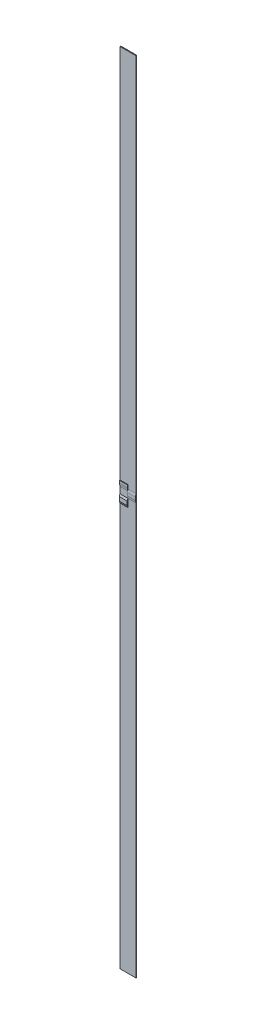
ISO-10303-21;
HEADER;
FILE_DESCRIPTION(('STEP AP214'),'2;1');
FILE_NAME('part.step','',(''),(''),'','','');
FILE_SCHEMA(('AUTOMOTIVE_DESIGN { 1 0 10303 214 1 1 1 1 }'));
ENDSEC;
DATA;
#1=APPLICATION_CONTEXT('core data for automotive mechanical design processes');
#2=APPLICATION_PROTOCOL_DEFINITION('international standard','automotive_design',2000,#1);
#3=PRODUCT_CONTEXT('',#1,'mechanical');
#4=PRODUCT('Part','Part','',(#3));
#5=PRODUCT_RELATED_PRODUCT_CATEGORY('part','',(#4));
#6=PRODUCT_DEFINITION_FORMATION('','',#4);
#7=PRODUCT_DEFINITION_CONTEXT('part definition',#1,'design');
#8=PRODUCT_DEFINITION('design','',#6,#7);
#9=PRODUCT_DEFINITION_SHAPE('','',#8);
#10=(LENGTH_UNIT() NAMED_UNIT(*) SI_UNIT(.MILLI.,.METRE.));
#11=(NAMED_UNIT(*) PLANE_ANGLE_UNIT() SI_UNIT($,.RADIAN.));
#12=(NAMED_UNIT(*) SI_UNIT($,.STERADIAN.) SOLID_ANGLE_UNIT());
#13=UNCERTAINTY_MEASURE_WITH_UNIT(LENGTH_MEASURE(1.E-05),#10,'distance_accuracy_value','');
#14=(GEOMETRIC_REPRESENTATION_CONTEXT(3) GLOBAL_UNCERTAINTY_ASSIGNED_CONTEXT((#13)) GLOBAL_UNIT_ASSIGNED_CONTEXT((#10,
#11,#12)) REPRESENTATION_CONTEXT('',''));
#15=CARTESIAN_POINT('',(0.,0.,0.));
#16=DIRECTION('',(0.,0.,1.));
#17=DIRECTION('',(1.,0.,0.));
#18=AXIS2_PLACEMENT_3D('',#15,#16,#17);
#19=CARTESIAN_POINT('',(0.,0.,100.));
#20=DIRECTION('',(0.,0.,-1.));
#21=DIRECTION('',(-1.,0.,0.));
#22=AXIS2_PLACEMENT_3D('',#19,#20,#21);
#23=PLANE('',#22);
#24=DIRECTION('',(0.,-1.,0.));
#25=VECTOR('',#24,1.);
#26=CARTESIAN_POINT('',(-5.80696598741327E-12,50000.,100.));
#27=LINE('',#26,#25);
#28=CARTESIAN_POINT('',(-3.67394039744204E-13,3000.,100.));
#29=VERTEX_POINT('',#28);
#30=CARTESIAN_POINT('',(2.22044604925031E-13,2500.,100.));
#31=VERTEX_POINT('',#30);
#32=EDGE_CURVE('E194',#29,#31,#27,.T.);
#33=ORIENTED_EDGE('',*,*,#32,.T.);
#34=DIRECTION('',(1.,0.,0.));
#35=VECTOR('',#34,1.);
#36=CARTESIAN_POINT('',(2.22044604925031E-13,2500.,100.));
#37=LINE('',#36,#35);
#38=CARTESIAN_POINT('',(1000.,2500.,100.));
#39=VERTEX_POINT('',#38);
#40=EDGE_CURVE('E295',#31,#39,#37,.T.);
#41=ORIENTED_EDGE('',*,*,#40,.T.);
#42=DIRECTION('',(0.,1.,0.));
#43=VECTOR('',#42,1.);
#44=CARTESIAN_POINT('',(999.999999999994,50000.,100.));
#45=LINE('',#44,#43);
#46=CARTESIAN_POINT('',(999.999999999994,50000.,100.));
#47=VERTEX_POINT('',#46);
#48=EDGE_CURVE('E139',#39,#47,#45,.T.);
#49=ORIENTED_EDGE('',*,*,#48,.T.);
#50=DIRECTION('',(-1.,0.,0.));
#51=VECTOR('',#50,1.);
#52=CARTESIAN_POINT('',(-5.80696598741327E-12,50000.,100.));
#53=LINE('',#52,#51);
#54=CARTESIAN_POINT('',(-1000.00000000001,50000.,100.));
#55=VERTEX_POINT('',#54);
#56=EDGE_CURVE('E162',#47,#55,#53,.T.);
#57=ORIENTED_EDGE('',*,*,#56,.T.);
#58=DIRECTION('',(0.,-1.,0.));
#59=VECTOR('',#58,1.);
#60=CARTESIAN_POINT('',(-1000.00000000001,50000.,100.));
#61=LINE('',#60,#59);
#62=CARTESIAN_POINT('',(-1000.,3000.,100.));
#63=VERTEX_POINT('',#62);
#64=EDGE_CURVE('E212',#55,#63,#61,.T.);
#65=ORIENTED_EDGE('',*,*,#64,.T.);
#66=DIRECTION('',(1.,0.,0.));
#67=VECTOR('',#66,1.);
#68=CARTESIAN_POINT('',(-1000.,3000.,100.));
#69=LINE('',#68,#67);
#70=EDGE_CURVE('E226',#63,#29,#69,.T.);
#71=ORIENTED_EDGE('',*,*,#70,.T.);
#72=EDGE_LOOP('',(#33,#41,#49,#57,#65,#71));
#73=FACE_BOUND('',#72,.T.);
#74=ADVANCED_FACE('F114',(#73),#23,.F.);
#75=CARTESIAN_POINT('',(1000.00000000001,-50000.,100.));
#76=VERTEX_POINT('',#75);
#77=CARTESIAN_POINT('',(1000.,1500.,100.));
#78=VERTEX_POINT('',#77);
#79=EDGE_CURVE('E172',#76,#78,#45,.T.);
#80=ORIENTED_EDGE('',*,*,#79,.T.);
#81=DIRECTION('',(1.,0.,0.));
#82=VECTOR('',#81,1.);
#83=CARTESIAN_POINT('',(2.22044604925031E-13,1500.,100.));
#84=LINE('',#83,#82);
#85=CARTESIAN_POINT('',(2.22044604925031E-13,1500.,100.));
#86=VERTEX_POINT('',#85);
#87=EDGE_CURVE('E220',#86,#78,#84,.T.);
#88=ORIENTED_EDGE('',*,*,#87,.F.);
#89=CARTESIAN_POINT('',(0.,500.,100.));
#90=VERTEX_POINT('',#89);
#91=EDGE_CURVE('E195',#86,#90,#27,.T.);
#92=ORIENTED_EDGE('',*,*,#91,.T.);
#93=DIRECTION('',(1.,0.,0.));
#94=VECTOR('',#93,1.);
#95=CARTESIAN_POINT('',(-1000.,500.,100.));
#96=LINE('',#95,#94);
#97=CARTESIAN_POINT('',(-1000.,500.,100.));
#98=VERTEX_POINT('',#97);
#99=EDGE_CURVE('E265',#98,#90,#96,.T.);
#100=ORIENTED_EDGE('',*,*,#99,.F.);
#101=DIRECTION('',(0.,-1.,0.));
#102=VECTOR('',#101,1.);
#103=CARTESIAN_POINT('',(-1000.,500.,100.));
#104=LINE('',#103,#102);
#105=CARTESIAN_POINT('',(-999.999999999994,-50000.,100.));
#106=VERTEX_POINT('',#105);
#107=EDGE_CURVE('E208',#98,#106,#104,.T.);
#108=ORIENTED_EDGE('',*,*,#107,.T.);
#109=DIRECTION('',(1.,0.,0.));
#110=VECTOR('',#109,1.);
#111=CARTESIAN_POINT('',(6.12323399573677E-12,-50000.,100.));
#112=LINE('',#111,#110);
#113=EDGE_CURVE('E191',#106,#76,#112,.T.);
#114=ORIENTED_EDGE('',*,*,#113,.T.);
#115=EDGE_LOOP('',(#80,#88,#92,#100,#108,#114));
#116=FACE_BOUND('',#115,.T.);
#117=ADVANCED_FACE('F369',(#116),#23,.F.);
#118=CARTESIAN_POINT('',(-5.80696598741327E-12,50000.,100.));
#119=DIRECTION('',(0.,-1.,0.));
#120=DIRECTION('',(0.,0.,-1.));
#121=AXIS2_PLACEMENT_3D('',#118,#119,#120);
#122=PLANE('',#121);
#123=DIRECTION('',(-1.,0.,0.));
#124=VECTOR('',#123,1.);
#125=CARTESIAN_POINT('',(-5.80696598741327E-12,50000.,0.));
#126=LINE('',#125,#124);
#127=CARTESIAN_POINT('',(999.999999999994,50000.,0.));
#128=VERTEX_POINT('',#127);
#129=CARTESIAN_POINT('',(-1000.00000000001,50000.,0.));
#130=VERTEX_POINT('',#129);
#131=EDGE_CURVE('E169',#128,#130,#126,.T.);
#132=ORIENTED_EDGE('',*,*,#131,.T.);
#133=DIRECTION('',(0.,0.,1.));
#134=VECTOR('',#133,1.);
#135=CARTESIAN_POINT('',(-1000.00000000001,50000.,0.));
#136=LINE('',#135,#134);
#137=EDGE_CURVE('E217',#130,#55,#136,.T.);
#138=ORIENTED_EDGE('',*,*,#137,.T.);
#139=ORIENTED_EDGE('',*,*,#56,.F.);
#140=DIRECTION('',(0.,0.,-1.));
#141=VECTOR('',#140,1.);
#142=CARTESIAN_POINT('',(999.999999999994,50000.,100.));
#143=LINE('',#142,#141);
#144=EDGE_CURVE('E123',#47,#128,#143,.T.);
#145=ORIENTED_EDGE('',*,*,#144,.T.);
#146=EDGE_LOOP('',(#132,#138,#139,#145));
#147=FACE_BOUND('',#146,.T.);
#148=ADVANCED_FACE('F116',(#147),#122,.F.);
#149=CARTESIAN_POINT('',(6.12323399573677E-12,-50000.,100.));
#150=DIRECTION('',(0.,1.,0.));
#151=DIRECTION('',(0.,0.,1.));
#152=AXIS2_PLACEMENT_3D('',#149,#150,#151);
#153=PLANE('',#152);
#154=DIRECTION('',(1.,0.,0.));
#155=VECTOR('',#154,1.);
#156=CARTESIAN_POINT('',(6.12323399573677E-12,-50000.,0.));
#157=LINE('',#156,#155);
#158=CARTESIAN_POINT('',(-999.999999999994,-50000.,0.));
#159=VERTEX_POINT('',#158);
#160=CARTESIAN_POINT('',(1000.00000000001,-50000.,0.));
#161=VERTEX_POINT('',#160);
#162=EDGE_CURVE('E163',#159,#161,#157,.T.);
#163=ORIENTED_EDGE('',*,*,#162,.T.);
#164=DIRECTION('',(0.,0.,-1.));
#165=VECTOR('',#164,1.);
#166=CARTESIAN_POINT('',(1000.00000000001,-50000.,100.));
#167=LINE('',#166,#165);
#168=EDGE_CURVE('E12',#76,#161,#167,.T.);
#169=ORIENTED_EDGE('',*,*,#168,.F.);
#170=ORIENTED_EDGE('',*,*,#113,.F.);
#171=DIRECTION('',(0.,0.,1.));
#172=VECTOR('',#171,1.);
#173=CARTESIAN_POINT('',(-999.999999999994,-50000.,0.));
#174=LINE('',#173,#172);
#175=EDGE_CURVE('E204',#159,#106,#174,.T.);
#176=ORIENTED_EDGE('',*,*,#175,.F.);
#177=EDGE_LOOP('',(#163,#169,#170,#176));
#178=FACE_BOUND('',#177,.T.);
#179=ADVANCED_FACE('F430',(#178),#153,.F.);
#180=CARTESIAN_POINT('',(999.999999999994,50000.,100.));
#181=DIRECTION('',(-1.,0.,0.));
#182=DIRECTION('',(0.,-1.,0.));
#183=AXIS2_PLACEMENT_3D('',#180,#181,#182);
#184=PLANE('',#183);
#185=DIRECTION('',(0.,1.,0.));
#186=VECTOR('',#185,1.);
#187=CARTESIAN_POINT('',(999.999999999994,50000.,0.));
#188=LINE('',#187,#186);
#189=EDGE_CURVE('E152',#161,#128,#188,.T.);
#190=ORIENTED_EDGE('',*,*,#189,.T.);
#191=ORIENTED_EDGE('',*,*,#144,.F.);
#192=ORIENTED_EDGE('',*,*,#48,.F.);
#193=DIRECTION('',(0.,-0.98058067569092,0.196116135138184));
#194=VECTOR('',#193,1.);
#195=CARTESIAN_POINT('',(1000.,2200.,160.));
#196=LINE('',#195,#194);
#197=CARTESIAN_POINT('',(1000.,2200.,160.));
#198=VERTEX_POINT('',#197);
#199=EDGE_CURVE('E319',#39,#198,#196,.T.);
#200=ORIENTED_EDGE('',*,*,#199,.T.);
#201=DIRECTION('',(0.,-1.,0.));
#202=VECTOR('',#201,1.);
#203=CARTESIAN_POINT('',(1000.,1800.,160.));
#204=LINE('',#203,#202);
#205=CARTESIAN_POINT('',(1000.,1800.,160.));
#206=VERTEX_POINT('',#205);
#207=EDGE_CURVE('E315',#198,#206,#204,.T.);
#208=ORIENTED_EDGE('',*,*,#207,.T.);
#209=DIRECTION('',(0.,-0.98058067569092,-0.196116135138184));
#210=VECTOR('',#209,1.);
#211=CARTESIAN_POINT('',(1000.,1500.,100.));
#212=LINE('',#211,#210);
#213=EDGE_CURVE('E310',#206,#78,#212,.T.);
#214=ORIENTED_EDGE('',*,*,#213,.T.);
#215=ORIENTED_EDGE('',*,*,#79,.F.);
#216=ORIENTED_EDGE('',*,*,#168,.T.);
#217=EDGE_LOOP('',(#190,#191,#192,#200,#208,#214,#215,#216));
#218=FACE_BOUND('',#217,.T.);
#219=ADVANCED_FACE('F154',(#218),#184,.F.);
#220=DIRECTION('',(1.,0.,0.));
#221=VECTOR('',#220,1.);
#222=CARTESIAN_POINT('',(-1000.,1500.,100.));
#223=LINE('',#222,#221);
#224=CARTESIAN_POINT('',(-1000.,1500.,100.));
#225=VERTEX_POINT('',#224);
#226=EDGE_CURVE('E185',#225,#86,#223,.T.);
#227=ORIENTED_EDGE('',*,*,#226,.T.);
#228=DIRECTION('',(0.,1.,0.));
#229=VECTOR('',#228,1.);
#230=CARTESIAN_POINT('',(2.22044604925031E-13,1500.,100.));
#231=LINE('',#230,#229);
#232=CARTESIAN_POINT('',(0.,2300.,100.));
#233=VERTEX_POINT('',#232);
#234=EDGE_CURVE('E314',#86,#233,#231,.T.);
#235=ORIENTED_EDGE('',*,*,#234,.T.);
#236=DIRECTION('',(1.,0.,0.));
#237=VECTOR('',#236,1.);
#238=CARTESIAN_POINT('',(-1000.,2300.,100.));
#239=LINE('',#238,#237);
#240=CARTESIAN_POINT('',(-1000.,2300.,100.));
#241=VERTEX_POINT('',#240);
#242=EDGE_CURVE('E230',#241,#233,#239,.T.);
#243=ORIENTED_EDGE('',*,*,#242,.F.);
#244=EDGE_CURVE('E216',#241,#225,#61,.T.);
#245=ORIENTED_EDGE('',*,*,#244,.T.);
#246=EDGE_LOOP('',(#227,#235,#243,#245));
#247=FACE_BOUND('',#246,.T.);
#248=ADVANCED_FACE('F380',(#247),#23,.F.);
#249=CARTESIAN_POINT('',(0.,0.,0.));
#250=DIRECTION('',(0.,0.,-1.));
#251=DIRECTION('',(-1.,0.,0.));
#252=AXIS2_PLACEMENT_3D('',#249,#250,#251);
#253=PLANE('',#252);
#254=ORIENTED_EDGE('',*,*,#131,.F.);
#255=ORIENTED_EDGE('',*,*,#189,.F.);
#256=ORIENTED_EDGE('',*,*,#162,.F.);
#257=DIRECTION('',(0.,-1.,0.));
#258=VECTOR('',#257,1.);
#259=CARTESIAN_POINT('',(-1000.00000000001,50000.,0.));
#260=LINE('',#259,#258);
#261=EDGE_CURVE('E175',#130,#159,#260,.T.);
#262=ORIENTED_EDGE('',*,*,#261,.F.);
#263=EDGE_LOOP('',(#254,#255,#256,#262));
#264=FACE_BOUND('',#263,.T.);
#265=ADVANCED_FACE('F173',(#264),#253,.T.);
#266=CARTESIAN_POINT('',(0.,0.,0.));
#267=DIRECTION('',(-1.,0.,0.));
#268=DIRECTION('',(0.,-1.,0.));
#269=AXIS2_PLACEMENT_3D('',#266,#267,#268);
#270=PLANE('',#269);
#271=DIRECTION('',(0.,0.98058067569092,0.196116135138184));
#272=VECTOR('',#271,1.);
#273=CARTESIAN_POINT('',(0.,69.2307692307693,-346.153846153846));
#274=LINE('',#273,#272);
#275=CARTESIAN_POINT('',(-2.93915231795363E-13,2400.,120.));
#276=VERTEX_POINT('',#275);
#277=CARTESIAN_POINT('',(-3.30654635769784E-13,2700.,180.));
#278=VERTEX_POINT('',#277);
#279=EDGE_CURVE('E244',#276,#278,#274,.T.);
#280=ORIENTED_EDGE('',*,*,#279,.F.);
#281=DIRECTION('',(0.,-0.98058067569092,0.196116135138184));
#282=VECTOR('',#281,1.);
#283=CARTESIAN_POINT('',(2.22044604925031E-13,2200.,160.));
#284=LINE('',#283,#282);
#285=EDGE_CURVE('E130',#31,#276,#284,.T.);
#286=ORIENTED_EDGE('',*,*,#285,.F.);
#287=ORIENTED_EDGE('',*,*,#32,.F.);
#288=DIRECTION('',(0.,0.,-1.));
#289=VECTOR('',#288,1.);
#290=CARTESIAN_POINT('',(-3.67394039744204E-13,3000.,0.));
#291=LINE('',#290,#289);
#292=CARTESIAN_POINT('',(-3.67394039744204E-13,3000.,180.));
#293=VERTEX_POINT('',#292);
#294=EDGE_CURVE('E245',#293,#29,#291,.T.);
#295=ORIENTED_EDGE('',*,*,#294,.F.);
#296=DIRECTION('',(0.,1.,0.));
#297=VECTOR('',#296,1.);
#298=CARTESIAN_POINT('',(0.,0.,180.));
#299=LINE('',#298,#297);
#300=EDGE_CURVE('E203',#278,#293,#299,.T.);
#301=ORIENTED_EDGE('',*,*,#300,.F.);
#302=EDGE_LOOP('',(#280,#286,#287,#295,#301));
#303=FACE_BOUND('',#302,.T.);
#304=ADVANCED_FACE('F448',(#303),#270,.F.);
#305=ORIENTED_EDGE('',*,*,#91,.F.);
#306=DIRECTION('',(0.,0.940887411868727,-0.338719468272742));
#307=VECTOR('',#306,1.);
#308=CARTESIAN_POINT('',(0.,203.966005665723,566.57223796034));
#309=LINE('',#308,#307);
#310=CARTESIAN_POINT('',(-1.53080849893418E-13,1250.,190.));
#311=VERTEX_POINT('',#310);
#312=EDGE_CURVE('E278',#311,#86,#309,.T.);
#313=ORIENTED_EDGE('',*,*,#312,.F.);
#314=DIRECTION('',(0.,1.,0.));
#315=VECTOR('',#314,1.);
#316=CARTESIAN_POINT('',(0.,2.32036612146676E-12,190.000000000015));
#317=LINE('',#316,#315);
#318=CARTESIAN_POINT('',(0.,750.,190.000000000006));
#319=VERTEX_POINT('',#318);
#320=EDGE_CURVE('E225',#319,#311,#317,.T.);
#321=ORIENTED_EDGE('',*,*,#320,.F.);
#322=DIRECTION('',(0.,0.94088741186872,0.338719468272762));
#323=VECTOR('',#322,1.);
#324=CARTESIAN_POINT('',(0.,25.4957507082205,-70.8215297450521));
#325=LINE('',#324,#323);
#326=EDGE_CURVE('E274',#90,#319,#325,.T.);
#327=ORIENTED_EDGE('',*,*,#326,.F.);
#328=EDGE_LOOP('',(#305,#313,#321,#327));
#329=FACE_BOUND('',#328,.T.);
#330=ADVANCED_FACE('F375',(#329),#270,.F.);
#331=CARTESIAN_POINT('',(-1000.,203.966005665722,566.57223796034));
#332=DIRECTION('',(0.,-0.338719468272742,-0.940887411868727));
#333=DIRECTION('',(0.,0.940887411868727,-0.338719468272742));
#334=AXIS2_PLACEMENT_3D('',#331,#332,#333);
#335=PLANE('',#334);
#336=ORIENTED_EDGE('',*,*,#312,.T.);
#337=ORIENTED_EDGE('',*,*,#226,.F.);
#338=DIRECTION('',(0.,0.940887411868727,-0.338719468272742));
#339=VECTOR('',#338,1.);
#340=CARTESIAN_POINT('',(-1000.,203.966005665722,566.57223796034));
#341=LINE('',#340,#339);
#342=CARTESIAN_POINT('',(-1000.,1250.,190.));
#343=VERTEX_POINT('',#342);
#344=EDGE_CURVE('E288',#343,#225,#341,.T.);
#345=ORIENTED_EDGE('',*,*,#344,.F.);
#346=DIRECTION('',(1.,0.,0.));
#347=VECTOR('',#346,1.);
#348=CARTESIAN_POINT('',(-1000.,1250.,190.));
#349=LINE('',#348,#347);
#350=EDGE_CURVE('E178',#343,#311,#349,.T.);
#351=ORIENTED_EDGE('',*,*,#350,.T.);
#352=EDGE_LOOP('',(#336,#337,#345,#351));
#353=FACE_BOUND('',#352,.T.);
#354=ADVANCED_FACE('F385',(#353),#335,.F.);
#355=CARTESIAN_POINT('',(-1000.,25.4957507082204,-70.8215297450521));
#356=DIRECTION('',(0.,0.338719468272762,-0.94088741186872));
#357=DIRECTION('',(0.,0.94088741186872,0.338719468272762));
#358=AXIS2_PLACEMENT_3D('',#355,#356,#357);
#359=PLANE('',#358);
#360=ORIENTED_EDGE('',*,*,#326,.T.);
#361=DIRECTION('',(1.,0.,0.));
#362=VECTOR('',#361,1.);
#363=CARTESIAN_POINT('',(-1000.,750.,190.000000000006));
#364=LINE('',#363,#362);
#365=CARTESIAN_POINT('',(-1000.,750.,190.000000000006));
#366=VERTEX_POINT('',#365);
#367=EDGE_CURVE('E269',#366,#319,#364,.T.);
#368=ORIENTED_EDGE('',*,*,#367,.F.);
#369=DIRECTION('',(0.,0.94088741186872,0.338719468272762));
#370=VECTOR('',#369,1.);
#371=CARTESIAN_POINT('',(-1000.,25.4957507082204,-70.8215297450521));
#372=LINE('',#371,#370);
#373=EDGE_CURVE('E273',#98,#366,#372,.T.);
#374=ORIENTED_EDGE('',*,*,#373,.F.);
#375=ORIENTED_EDGE('',*,*,#99,.T.);
#376=EDGE_LOOP('',(#360,#368,#374,#375));
#377=FACE_BOUND('',#376,.T.);
#378=ADVANCED_FACE('F434',(#377),#359,.F.);
#379=CARTESIAN_POINT('',(-1000.,2.19790144155203E-12,190.000000000015));
#380=DIRECTION('',(0.,0.,-1.));
#381=DIRECTION('',(0.,1.,0.));
#382=AXIS2_PLACEMENT_3D('',#379,#380,#381);
#383=PLANE('',#382);
#384=ORIENTED_EDGE('',*,*,#320,.T.);
#385=ORIENTED_EDGE('',*,*,#350,.F.);
#386=DIRECTION('',(0.,1.,0.));
#387=VECTOR('',#386,1.);
#388=CARTESIAN_POINT('',(-1000.,2.19790144155203E-12,190.000000000015));
#389=LINE('',#388,#387);
#390=EDGE_CURVE('E277',#366,#343,#389,.T.);
#391=ORIENTED_EDGE('',*,*,#390,.F.);
#392=ORIENTED_EDGE('',*,*,#367,.T.);
#393=EDGE_LOOP('',(#384,#385,#391,#392));
#394=FACE_BOUND('',#393,.T.);
#395=ADVANCED_FACE('F392',(#394),#383,.F.);
#396=CARTESIAN_POINT('',(-1000.,-1.22464679914735E-13,0.));
#397=DIRECTION('',(-1.,0.,0.));
#398=DIRECTION('',(0.,-1.,0.));
#399=AXIS2_PLACEMENT_3D('',#396,#397,#398);
#400=PLANE('',#399);
#401=ORIENTED_EDGE('',*,*,#390,.T.);
#402=ORIENTED_EDGE('',*,*,#344,.T.);
#403=ORIENTED_EDGE('',*,*,#244,.F.);
#404=DIRECTION('',(0.,0.98058067569092,0.196116135138184));
#405=VECTOR('',#404,1.);
#406=CARTESIAN_POINT('',(-1000.,69.2307692307691,-346.153846153846));
#407=LINE('',#406,#405);
#408=CARTESIAN_POINT('',(-1000.,2700.,180.));
#409=VERTEX_POINT('',#408);
#410=EDGE_CURVE('E238',#241,#409,#407,.T.);
#411=ORIENTED_EDGE('',*,*,#410,.T.);
#412=DIRECTION('',(0.,1.,0.));
#413=VECTOR('',#412,1.);
#414=CARTESIAN_POINT('',(-1000.,-1.22464679914735E-13,180.));
#415=LINE('',#414,#413);
#416=CARTESIAN_POINT('',(-1000.,3000.,180.));
#417=VERTEX_POINT('',#416);
#418=EDGE_CURVE('E243',#409,#417,#415,.T.);
#419=ORIENTED_EDGE('',*,*,#418,.T.);
#420=DIRECTION('',(0.,0.,-1.));
#421=VECTOR('',#420,1.);
#422=CARTESIAN_POINT('',(-1000.,3000.,0.));
#423=LINE('',#422,#421);
#424=EDGE_CURVE('E255',#417,#63,#423,.T.);
#425=ORIENTED_EDGE('',*,*,#424,.T.);
#426=ORIENTED_EDGE('',*,*,#64,.F.);
#427=ORIENTED_EDGE('',*,*,#137,.F.);
#428=ORIENTED_EDGE('',*,*,#261,.T.);
#429=ORIENTED_EDGE('',*,*,#175,.T.);
#430=ORIENTED_EDGE('',*,*,#107,.F.);
#431=ORIENTED_EDGE('',*,*,#373,.T.);
#432=EDGE_LOOP('',(#401,#402,#403,#411,#419,#425,#426,#427,#428,#429,#430,#431));
#433=FACE_BOUND('',#432,.T.);
#434=ADVANCED_FACE('F427',(#433),#400,.T.);
#435=CARTESIAN_POINT('',(-1000.,-1.22464679914735E-13,180.));
#436=DIRECTION('',(0.,0.,-1.));
#437=DIRECTION('',(-1.,0.,0.));
#438=AXIS2_PLACEMENT_3D('',#435,#436,#437);
#439=PLANE('',#438);
#440=ORIENTED_EDGE('',*,*,#300,.T.);
#441=DIRECTION('',(1.,0.,0.));
#442=VECTOR('',#441,1.);
#443=CARTESIAN_POINT('',(-1000.,3000.,180.));
#444=LINE('',#443,#442);
#445=EDGE_CURVE('E221',#417,#293,#444,.T.);
#446=ORIENTED_EDGE('',*,*,#445,.F.);
#447=ORIENTED_EDGE('',*,*,#418,.F.);
#448=DIRECTION('',(1.,0.,0.));
#449=VECTOR('',#448,1.);
#450=CARTESIAN_POINT('',(-1000.,2700.,180.));
#451=LINE('',#450,#449);
#452=EDGE_CURVE('E234',#409,#278,#451,.T.);
#453=ORIENTED_EDGE('',*,*,#452,.T.);
#454=EDGE_LOOP('',(#440,#446,#447,#453));
#455=FACE_BOUND('',#454,.T.);
#456=ADVANCED_FACE('F455',(#455),#439,.F.);
#457=CARTESIAN_POINT('',(-1000.,3000.,0.));
#458=DIRECTION('',(0.,-1.,0.));
#459=DIRECTION('',(1.,0.,0.));
#460=AXIS2_PLACEMENT_3D('',#457,#458,#459);
#461=PLANE('',#460);
#462=ORIENTED_EDGE('',*,*,#294,.T.);
#463=ORIENTED_EDGE('',*,*,#70,.F.);
#464=ORIENTED_EDGE('',*,*,#424,.F.);
#465=ORIENTED_EDGE('',*,*,#445,.T.);
#466=EDGE_LOOP('',(#462,#463,#464,#465));
#467=FACE_BOUND('',#466,.T.);
#468=ADVANCED_FACE('F452',(#467),#461,.F.);
#469=CARTESIAN_POINT('',(-1000.,69.2307692307691,-346.153846153846));
#470=DIRECTION('',(0.,0.196116135138184,-0.98058067569092));
#471=DIRECTION('',(0.,0.98058067569092,0.196116135138184));
#472=AXIS2_PLACEMENT_3D('',#469,#470,#471);
#473=PLANE('',#472);
#474=EDGE_CURVE('E239',#233,#276,#274,.T.);
#475=ORIENTED_EDGE('',*,*,#474,.T.);
#476=ORIENTED_EDGE('',*,*,#279,.T.);
#477=ORIENTED_EDGE('',*,*,#452,.F.);
#478=ORIENTED_EDGE('',*,*,#410,.F.);
#479=ORIENTED_EDGE('',*,*,#242,.T.);
#480=EDGE_LOOP('',(#475,#476,#477,#478,#479));
#481=FACE_BOUND('',#480,.T.);
#482=ADVANCED_FACE('F459',(#481),#473,.F.);
#483=CARTESIAN_POINT('',(-1.11022302462516E-13,-1.22124532708767E-13,0.));
#484=DIRECTION('',(-1.,0.,0.));
#485=DIRECTION('',(0.,0.,1.));
#486=AXIS2_PLACEMENT_3D('',#483,#484,#485);
#487=PLANE('',#486);
#488=ORIENTED_EDGE('',*,*,#474,.F.);
#489=ORIENTED_EDGE('',*,*,#234,.F.);
#490=DIRECTION('',(0.,-0.98058067569092,-0.196116135138184));
#491=VECTOR('',#490,1.);
#492=CARTESIAN_POINT('',(2.22044604925031E-13,1500.,100.));
#493=LINE('',#492,#491);
#494=CARTESIAN_POINT('',(2.22044604925031E-13,1800.,160.));
#495=VERTEX_POINT('',#494);
#496=EDGE_CURVE('E299',#495,#86,#493,.T.);
#497=ORIENTED_EDGE('',*,*,#496,.F.);
#498=DIRECTION('',(0.,-1.,0.));
#499=VECTOR('',#498,1.);
#500=CARTESIAN_POINT('',(2.22044604925031E-13,1800.,160.));
#501=LINE('',#500,#499);
#502=CARTESIAN_POINT('',(2.22044604925031E-13,2200.,160.));
#503=VERTEX_POINT('',#502);
#504=EDGE_CURVE('E326',#503,#495,#501,.T.);
#505=ORIENTED_EDGE('',*,*,#504,.F.);
#506=EDGE_CURVE('E332',#276,#503,#284,.T.);
#507=ORIENTED_EDGE('',*,*,#506,.F.);
#508=EDGE_LOOP('',(#488,#489,#497,#505,#507));
#509=FACE_BOUND('',#508,.T.);
#510=ADVANCED_FACE('F357',(#509),#487,.T.);
#511=CARTESIAN_POINT('',(2.22044604925031E-13,1500.,100.));
#512=DIRECTION('',(0.,-0.196116135138184,0.98058067569092));
#513=DIRECTION('',(0.,-0.98058067569092,-0.196116135138184));
#514=AXIS2_PLACEMENT_3D('',#511,#512,#513);
#515=PLANE('',#514);
#516=ORIENTED_EDGE('',*,*,#213,.F.);
#517=DIRECTION('',(1.,0.,0.));
#518=VECTOR('',#517,1.);
#519=CARTESIAN_POINT('',(2.22044604925031E-13,1800.,160.));
#520=LINE('',#519,#518);
#521=EDGE_CURVE('E303',#495,#206,#520,.T.);
#522=ORIENTED_EDGE('',*,*,#521,.F.);
#523=ORIENTED_EDGE('',*,*,#496,.T.);
#524=ORIENTED_EDGE('',*,*,#87,.T.);
#525=EDGE_LOOP('',(#516,#522,#523,#524));
#526=FACE_BOUND('',#525,.T.);
#527=ADVANCED_FACE('F364',(#526),#515,.T.);
#528=CARTESIAN_POINT('',(2.22044604925031E-13,1800.,160.));
#529=DIRECTION('',(0.,0.,1.));
#530=DIRECTION('',(1.,0.,0.));
#531=AXIS2_PLACEMENT_3D('',#528,#529,#530);
#532=PLANE('',#531);
#533=ORIENTED_EDGE('',*,*,#207,.F.);
#534=DIRECTION('',(1.,0.,0.));
#535=VECTOR('',#534,1.);
#536=CARTESIAN_POINT('',(2.22044604925031E-13,2200.,160.));
#537=LINE('',#536,#535);
#538=EDGE_CURVE('E298',#503,#198,#537,.T.);
#539=ORIENTED_EDGE('',*,*,#538,.F.);
#540=ORIENTED_EDGE('',*,*,#504,.T.);
#541=ORIENTED_EDGE('',*,*,#521,.T.);
#542=EDGE_LOOP('',(#533,#539,#540,#541));
#543=FACE_BOUND('',#542,.T.);
#544=ADVANCED_FACE('F355',(#543),#532,.T.);
#545=CARTESIAN_POINT('',(2.22044604925031E-13,2200.,160.));
#546=DIRECTION('',(0.,0.196116135138184,0.98058067569092));
#547=DIRECTION('',(0.,-0.98058067569092,0.196116135138184));
#548=AXIS2_PLACEMENT_3D('',#545,#546,#547);
#549=PLANE('',#548);
#550=ORIENTED_EDGE('',*,*,#199,.F.);
#551=ORIENTED_EDGE('',*,*,#40,.F.);
#552=ORIENTED_EDGE('',*,*,#285,.T.);
#553=ORIENTED_EDGE('',*,*,#506,.T.);
#554=ORIENTED_EDGE('',*,*,#538,.T.);
#555=EDGE_LOOP('',(#550,#551,#552,#553,#554));
#556=FACE_BOUND('',#555,.T.);
#557=ADVANCED_FACE('F344',(#556),#549,.T.);
#558=CLOSED_SHELL('',(#74,#117,#148,#179,#219,#248,#265,#304,#330,#354,#378,#395,#434,#456,#468,
#482,#510,#527,#544,#557));
#559=MANIFOLD_SOLID_BREP('B2',#558);
#560=ADVANCED_BREP_SHAPE_REPRESENTATION('',(#18,#559),#14);
#561=SHAPE_DEFINITION_REPRESENTATION(#9,#560);
ENDSEC;
END-ISO-10303-21;
